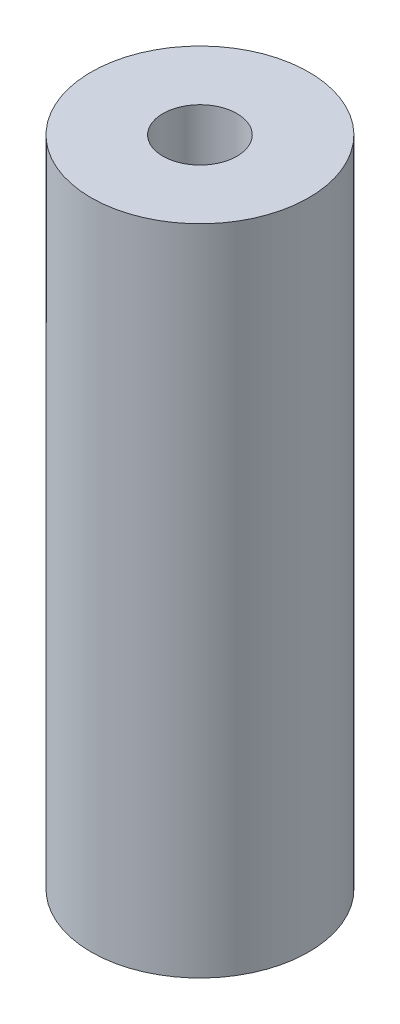
ISO-10303-21;
HEADER;
FILE_DESCRIPTION(('STEP AP214'),'2;1');
FILE_NAME('part.step','',(''),(''),'','','');
FILE_SCHEMA(('AUTOMOTIVE_DESIGN { 1 0 10303 214 1 1 1 1 }'));
ENDSEC;
DATA;
#1=APPLICATION_CONTEXT('core data for automotive mechanical design processes');
#2=APPLICATION_PROTOCOL_DEFINITION('international standard','automotive_design',2000,#1);
#3=PRODUCT_CONTEXT('',#1,'mechanical');
#4=PRODUCT('Part','Part','',(#3));
#5=PRODUCT_RELATED_PRODUCT_CATEGORY('part','',(#4));
#6=PRODUCT_DEFINITION_FORMATION('','',#4);
#7=PRODUCT_DEFINITION_CONTEXT('part definition',#1,'design');
#8=PRODUCT_DEFINITION('design','',#6,#7);
#9=PRODUCT_DEFINITION_SHAPE('','',#8);
#10=(LENGTH_UNIT() NAMED_UNIT(*) SI_UNIT(.MILLI.,.METRE.));
#11=(NAMED_UNIT(*) PLANE_ANGLE_UNIT() SI_UNIT($,.RADIAN.));
#12=(NAMED_UNIT(*) SI_UNIT($,.STERADIAN.) SOLID_ANGLE_UNIT());
#13=UNCERTAINTY_MEASURE_WITH_UNIT(LENGTH_MEASURE(1.E-05),#10,'distance_accuracy_value','');
#14=(GEOMETRIC_REPRESENTATION_CONTEXT(3) GLOBAL_UNCERTAINTY_ASSIGNED_CONTEXT((#13)) GLOBAL_UNIT_ASSIGNED_CONTEXT((#10,
#11,#12)) REPRESENTATION_CONTEXT('',''));
#15=CARTESIAN_POINT('',(0.,0.,0.));
#16=DIRECTION('',(0.,0.,1.));
#17=DIRECTION('',(1.,0.,0.));
#18=AXIS2_PLACEMENT_3D('',#15,#16,#17);
#19=CARTESIAN_POINT('',(0.,17.,0.));
#20=DIRECTION('',(0.,-1.,0.));
#21=DIRECTION('',(0.,0.,-1.));
#22=AXIS2_PLACEMENT_3D('',#19,#20,#21);
#23=CYLINDRICAL_SURFACE('',#22,2.5);
#24=CARTESIAN_POINT('',(0.,17.,0.));
#25=DIRECTION('',(0.,1.,0.));
#26=DIRECTION('',(0.,0.,1.));
#27=AXIS2_PLACEMENT_3D('',#24,#25,#26);
#28=CIRCLE('',#27,2.5);
#29=CARTESIAN_POINT('',(0.,17.,2.5));
#30=VERTEX_POINT('',#29);
#31=EDGE_CURVE('E10',#30,#30,#28,.T.);
#32=ORIENTED_EDGE('',*,*,#31,.F.);
#33=EDGE_LOOP('',(#32));
#34=FACE_BOUND('',#33,.T.);
#35=CARTESIAN_POINT('',(0.,2.,0.));
#36=DIRECTION('',(0.,1.,0.));
#37=DIRECTION('',(0.,0.,1.));
#38=AXIS2_PLACEMENT_3D('',#35,#36,#37);
#39=CIRCLE('',#38,2.5);
#40=CARTESIAN_POINT('',(0.,2.,2.5));
#41=VERTEX_POINT('',#40);
#42=EDGE_CURVE('E51',#41,#41,#39,.T.);
#43=ORIENTED_EDGE('',*,*,#42,.T.);
#44=EDGE_LOOP('',(#43));
#45=FACE_BOUND('',#44,.T.);
#46=ADVANCED_FACE('F43',(#34,#45),#23,.T.);
#47=CARTESIAN_POINT('',(0.,17.,0.));
#48=DIRECTION('',(0.,1.,0.));
#49=DIRECTION('',(0.,0.,1.));
#50=AXIS2_PLACEMENT_3D('',#47,#48,#49);
#51=PLANE('',#50);
#52=CARTESIAN_POINT('',(0.,17.,0.));
#53=DIRECTION('',(0.,1.,0.));
#54=DIRECTION('',(0.,0.,1.));
#55=AXIS2_PLACEMENT_3D('',#52,#53,#54);
#56=CIRCLE('',#55,0.85);
#57=CARTESIAN_POINT('',(0.,17.,0.85));
#58=VERTEX_POINT('',#57);
#59=EDGE_CURVE('E57',#58,#58,#56,.T.);
#60=ORIENTED_EDGE('',*,*,#59,.F.);
#61=EDGE_LOOP('',(#60));
#62=FACE_BOUND('',#61,.T.);
#63=ORIENTED_EDGE('',*,*,#31,.T.);
#64=EDGE_LOOP('',(#63));
#65=FACE_BOUND('',#64,.T.);
#66=ADVANCED_FACE('F88',(#62,#65),#51,.T.);
#67=CARTESIAN_POINT('',(0.,2.,0.));
#68=DIRECTION('',(0.,1.,0.));
#69=DIRECTION('',(0.,0.,1.));
#70=AXIS2_PLACEMENT_3D('',#67,#68,#69);
#71=PLANE('',#70);
#72=CARTESIAN_POINT('',(0.,2.,0.));
#73=DIRECTION('',(0.,1.,0.));
#74=DIRECTION('',(0.,0.,1.));
#75=AXIS2_PLACEMENT_3D('',#72,#73,#74);
#76=CIRCLE('',#75,1.25);
#77=CARTESIAN_POINT('',(0.,2.,1.25));
#78=VERTEX_POINT('',#77);
#79=EDGE_CURVE('E62',#78,#78,#76,.F.);
#80=ORIENTED_EDGE('',*,*,#79,.F.);
#81=EDGE_LOOP('',(#80));
#82=FACE_BOUND('',#81,.T.);
#83=ORIENTED_EDGE('',*,*,#42,.F.);
#84=EDGE_LOOP('',(#83));
#85=FACE_BOUND('',#84,.T.);
#86=ADVANCED_FACE('F94',(#82,#85),#71,.F.);
#87=CARTESIAN_POINT('',(0.,9.,0.));
#88=DIRECTION('',(0.,1.,0.));
#89=DIRECTION('',(0.,0.,1.));
#90=AXIS2_PLACEMENT_3D('',#87,#88,#89);
#91=CYLINDRICAL_SURFACE('',#90,0.85);
#92=CARTESIAN_POINT('',(0.,10.,0.));
#93=DIRECTION('',(0.,1.,0.));
#94=DIRECTION('',(0.,0.,1.));
#95=AXIS2_PLACEMENT_3D('',#92,#93,#94);
#96=CIRCLE('',#95,0.85);
#97=CARTESIAN_POINT('',(0.,10.,0.85));
#98=VERTEX_POINT('',#97);
#99=EDGE_CURVE('E46',#98,#98,#96,.F.);
#100=ORIENTED_EDGE('',*,*,#99,.T.);
#101=EDGE_LOOP('',(#100));
#102=FACE_BOUND('',#101,.T.);
#103=ORIENTED_EDGE('',*,*,#59,.T.);
#104=EDGE_LOOP('',(#103));
#105=FACE_BOUND('',#104,.T.);
#106=ADVANCED_FACE('F75',(#102,#105),#91,.F.);
#107=CARTESIAN_POINT('',(0.,10.,0.));
#108=DIRECTION('',(0.,-1.,0.));
#109=DIRECTION('',(0.,0.,-1.));
#110=AXIS2_PLACEMENT_3D('',#107,#108,#109);
#111=CYLINDRICAL_SURFACE('',#110,1.25);
#112=CARTESIAN_POINT('',(0.,10.,0.));
#113=DIRECTION('',(0.,1.,0.));
#114=DIRECTION('',(0.,0.,1.));
#115=AXIS2_PLACEMENT_3D('',#112,#113,#114);
#116=CIRCLE('',#115,1.25);
#117=CARTESIAN_POINT('',(0.,10.,1.25));
#118=VERTEX_POINT('',#117);
#119=EDGE_CURVE('E66',#118,#118,#116,.T.);
#120=ORIENTED_EDGE('',*,*,#119,.T.);
#121=EDGE_LOOP('',(#120));
#122=FACE_BOUND('',#121,.T.);
#123=ORIENTED_EDGE('',*,*,#79,.T.);
#124=EDGE_LOOP('',(#123));
#125=FACE_BOUND('',#124,.T.);
#126=ADVANCED_FACE('F80',(#122,#125),#111,.F.);
#127=CARTESIAN_POINT('',(0.,10.,0.));
#128=DIRECTION('',(0.,1.,0.));
#129=DIRECTION('',(0.,0.,1.));
#130=AXIS2_PLACEMENT_3D('',#127,#128,#129);
#131=PLANE('',#130);
#132=ORIENTED_EDGE('',*,*,#119,.F.);
#133=EDGE_LOOP('',(#132));
#134=FACE_BOUND('',#133,.T.);
#135=ORIENTED_EDGE('',*,*,#99,.F.);
#136=EDGE_LOOP('',(#135));
#137=FACE_BOUND('',#136,.T.);
#138=ADVANCED_FACE('F78',(#134,#137),#131,.F.);
#139=CLOSED_SHELL('',(#46,#66,#86,#106,#126,#138));
#140=MANIFOLD_SOLID_BREP('B2',#139);
#141=ADVANCED_BREP_SHAPE_REPRESENTATION('',(#18,#140),#14);
#142=SHAPE_DEFINITION_REPRESENTATION(#9,#141);
ENDSEC;
END-ISO-10303-21;
